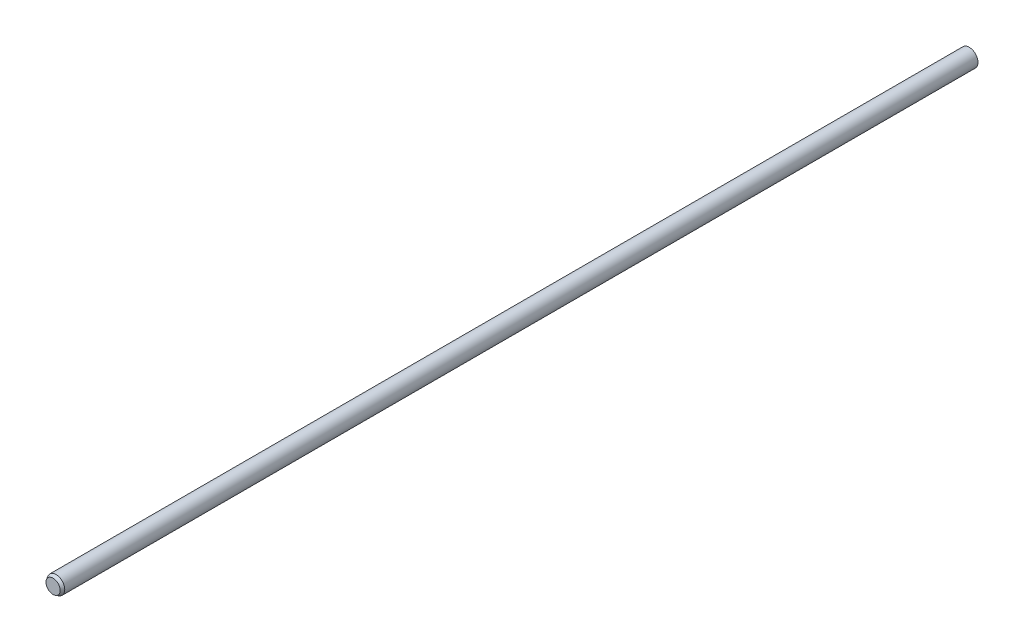
ISO-10303-21;
HEADER;
FILE_DESCRIPTION(('STEP AP214'),'2;1');
FILE_NAME('part.step','',(''),(''),'','','');
FILE_SCHEMA(('AUTOMOTIVE_DESIGN { 1 0 10303 214 1 1 1 1 }'));
ENDSEC;
DATA;
#1=APPLICATION_CONTEXT('core data for automotive mechanical design processes');
#2=APPLICATION_PROTOCOL_DEFINITION('international standard','automotive_design',2000,#1);
#3=PRODUCT_CONTEXT('',#1,'mechanical');
#4=PRODUCT('Part','Part','',(#3));
#5=PRODUCT_RELATED_PRODUCT_CATEGORY('part','',(#4));
#6=PRODUCT_DEFINITION_FORMATION('','',#4);
#7=PRODUCT_DEFINITION_CONTEXT('part definition',#1,'design');
#8=PRODUCT_DEFINITION('design','',#6,#7);
#9=PRODUCT_DEFINITION_SHAPE('','',#8);
#10=(LENGTH_UNIT() NAMED_UNIT(*) SI_UNIT(.MILLI.,.METRE.));
#11=(NAMED_UNIT(*) PLANE_ANGLE_UNIT() SI_UNIT($,.RADIAN.));
#12=(NAMED_UNIT(*) SI_UNIT($,.STERADIAN.) SOLID_ANGLE_UNIT());
#13=UNCERTAINTY_MEASURE_WITH_UNIT(LENGTH_MEASURE(1.E-05),#10,'distance_accuracy_value','');
#14=(GEOMETRIC_REPRESENTATION_CONTEXT(3) GLOBAL_UNCERTAINTY_ASSIGNED_CONTEXT((#13)) GLOBAL_UNIT_ASSIGNED_CONTEXT((#10,
#11,#12)) REPRESENTATION_CONTEXT('',''));
#15=CARTESIAN_POINT('',(0.,0.,0.));
#16=DIRECTION('',(0.,0.,1.));
#17=DIRECTION('',(1.,0.,0.));
#18=AXIS2_PLACEMENT_3D('',#15,#16,#17);
#19=CARTESIAN_POINT('',(0.,0.,314.));
#20=DIRECTION('',(0.,0.,-1.));
#21=DIRECTION('',(-1.,0.,0.));
#22=AXIS2_PLACEMENT_3D('',#19,#20,#21);
#23=CYLINDRICAL_SURFACE('',#22,3.);
#24=CARTESIAN_POINT('',(0.,0.,0.577350269189703));
#25=DIRECTION('',(0.,0.,1.));
#26=DIRECTION('',(1.,0.,0.));
#27=AXIS2_PLACEMENT_3D('',#24,#25,#26);
#28=CIRCLE('',#27,3.);
#29=CARTESIAN_POINT('',(3.,0.,0.577350269189703));
#30=VERTEX_POINT('',#29);
#31=EDGE_CURVE('E54',#30,#30,#28,.T.);
#32=ORIENTED_EDGE('',*,*,#31,.T.);
#33=EDGE_LOOP('',(#32));
#34=FACE_BOUND('',#33,.T.);
#35=CARTESIAN_POINT('',(0.,0.,313.));
#36=DIRECTION('',(0.,0.,1.));
#37=DIRECTION('',(1.,0.,0.));
#38=AXIS2_PLACEMENT_3D('',#35,#36,#37);
#39=CIRCLE('',#38,3.);
#40=CARTESIAN_POINT('',(3.,0.,313.));
#41=VERTEX_POINT('',#40);
#42=EDGE_CURVE('E59',#41,#41,#39,.F.);
#43=ORIENTED_EDGE('',*,*,#42,.T.);
#44=EDGE_LOOP('',(#43));
#45=FACE_BOUND('',#44,.T.);
#46=ADVANCED_FACE('F41',(#34,#45),#23,.T.);
#47=CARTESIAN_POINT('',(0.,0.,314.));
#48=DIRECTION('',(0.,0.,1.));
#49=DIRECTION('',(1.,0.,0.));
#50=AXIS2_PLACEMENT_3D('',#47,#48,#49);
#51=PLANE('',#50);
#52=CARTESIAN_POINT('',(0.,0.,314.));
#53=DIRECTION('',(0.,0.,1.));
#54=DIRECTION('',(1.,0.,0.));
#55=AXIS2_PLACEMENT_3D('',#52,#53,#54);
#56=CIRCLE('',#55,2.42264973081033);
#57=CARTESIAN_POINT('',(2.42264973081033,0.,314.));
#58=VERTEX_POINT('',#57);
#59=EDGE_CURVE('E10',#58,#58,#56,.T.);
#60=ORIENTED_EDGE('',*,*,#59,.T.);
#61=EDGE_LOOP('',(#60));
#62=FACE_BOUND('',#61,.T.);
#63=ADVANCED_FACE('F76',(#62),#51,.T.);
#64=CARTESIAN_POINT('',(0.,0.,0.));
#65=DIRECTION('',(0.,0.,1.));
#66=DIRECTION('',(1.,0.,0.));
#67=AXIS2_PLACEMENT_3D('',#64,#65,#66);
#68=PLANE('',#67);
#69=CARTESIAN_POINT('',(0.,0.,0.));
#70=DIRECTION('',(0.,0.,1.));
#71=DIRECTION('',(1.,0.,0.));
#72=AXIS2_PLACEMENT_3D('',#69,#70,#71);
#73=CIRCLE('',#72,1.99999999999995);
#74=CARTESIAN_POINT('',(1.99999999999995,0.,0.));
#75=VERTEX_POINT('',#74);
#76=EDGE_CURVE('E49',#75,#75,#73,.F.);
#77=ORIENTED_EDGE('',*,*,#76,.T.);
#78=EDGE_LOOP('',(#77));
#79=FACE_BOUND('',#78,.T.);
#80=ADVANCED_FACE('F73',(#79),#68,.F.);
#81=CARTESIAN_POINT('',(0.,0.,0.577350269189703));
#82=DIRECTION('',(0.,0.,1.));
#83=DIRECTION('',(1.,0.,0.));
#84=AXIS2_PLACEMENT_3D('',#81,#82,#83);
#85=CONICAL_SURFACE('',#84,3.,1.04719755119656);
#86=ORIENTED_EDGE('',*,*,#76,.F.);
#87=EDGE_LOOP('',(#86));
#88=FACE_BOUND('',#87,.T.);
#89=ORIENTED_EDGE('',*,*,#31,.F.);
#90=EDGE_LOOP('',(#89));
#91=FACE_BOUND('',#90,.T.);
#92=ADVANCED_FACE('F69',(#88,#91),#85,.T.);
#93=CARTESIAN_POINT('',(0.,0.,314.));
#94=DIRECTION('',(0.,0.,-1.));
#95=DIRECTION('',(-1.,0.,0.));
#96=AXIS2_PLACEMENT_3D('',#93,#94,#95);
#97=CONICAL_SURFACE('',#96,2.42264973081033,0.523598775598286);
#98=ORIENTED_EDGE('',*,*,#42,.F.);
#99=EDGE_LOOP('',(#98));
#100=FACE_BOUND('',#99,.T.);
#101=ORIENTED_EDGE('',*,*,#59,.F.);
#102=EDGE_LOOP('',(#101));
#103=FACE_BOUND('',#102,.T.);
#104=ADVANCED_FACE('F43',(#100,#103),#97,.T.);
#105=CLOSED_SHELL('',(#46,#63,#80,#92,#104));
#106=MANIFOLD_SOLID_BREP('B2',#105);
#107=ADVANCED_BREP_SHAPE_REPRESENTATION('',(#18,#106),#14);
#108=SHAPE_DEFINITION_REPRESENTATION(#9,#107);
ENDSEC;
END-ISO-10303-21;
